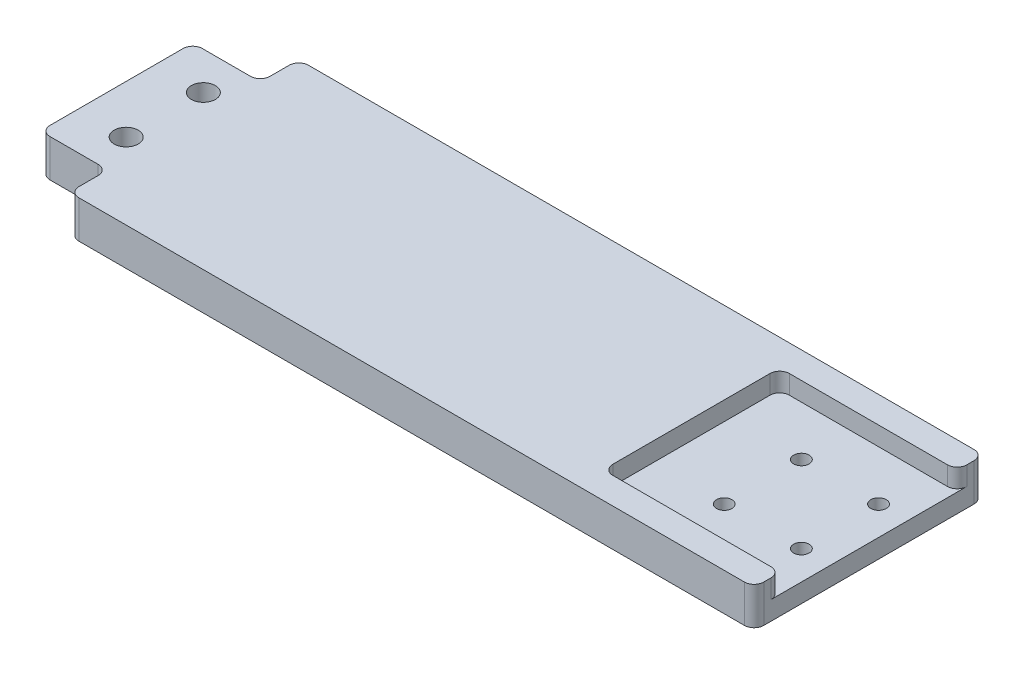
ISO-10303-21;
HEADER;
FILE_DESCRIPTION(('STEP AP214'),'2;1');
FILE_NAME('part.step','',(''),(''),'','','');
FILE_SCHEMA(('AUTOMOTIVE_DESIGN { 1 0 10303 214 1 1 1 1 }'));
ENDSEC;
DATA;
#1=APPLICATION_CONTEXT('core data for automotive mechanical design processes');
#2=APPLICATION_PROTOCOL_DEFINITION('international standard','automotive_design',2000,#1);
#3=PRODUCT_CONTEXT('',#1,'mechanical');
#4=PRODUCT('Part','Part','',(#3));
#5=PRODUCT_RELATED_PRODUCT_CATEGORY('part','',(#4));
#6=PRODUCT_DEFINITION_FORMATION('','',#4);
#7=PRODUCT_DEFINITION_CONTEXT('part definition',#1,'design');
#8=PRODUCT_DEFINITION('design','',#6,#7);
#9=PRODUCT_DEFINITION_SHAPE('','',#8);
#10=(LENGTH_UNIT() NAMED_UNIT(*) SI_UNIT(.MILLI.,.METRE.));
#11=(NAMED_UNIT(*) PLANE_ANGLE_UNIT() SI_UNIT($,.RADIAN.));
#12=(NAMED_UNIT(*) SI_UNIT($,.STERADIAN.) SOLID_ANGLE_UNIT());
#13=UNCERTAINTY_MEASURE_WITH_UNIT(LENGTH_MEASURE(1.E-05),#10,'distance_accuracy_value','');
#14=(GEOMETRIC_REPRESENTATION_CONTEXT(3) GLOBAL_UNCERTAINTY_ASSIGNED_CONTEXT((#13)) GLOBAL_UNIT_ASSIGNED_CONTEXT((#10,
#11,#12)) REPRESENTATION_CONTEXT('',''));
#15=CARTESIAN_POINT('',(0.,0.,0.));
#16=DIRECTION('',(0.,0.,1.));
#17=DIRECTION('',(1.,0.,0.));
#18=AXIS2_PLACEMENT_3D('',#15,#16,#17);
#19=CARTESIAN_POINT('',(-17.,3.9,-11.9));
#20=DIRECTION('',(-1.,0.,0.));
#21=DIRECTION('',(0.,0.,1.));
#22=AXIS2_PLACEMENT_3D('',#19,#20,#21);
#23=PLANE('',#22);
#24=DIRECTION('',(0.,0.,-1.));
#25=VECTOR('',#24,1.);
#26=CARTESIAN_POINT('',(-17.,3.9,-11.9));
#27=LINE('',#26,#25);
#28=CARTESIAN_POINT('',(-17.,3.9,10.9));
#29=VERTEX_POINT('',#28);
#30=CARTESIAN_POINT('',(-17.,3.9,10.15));
#31=VERTEX_POINT('',#30);
#32=EDGE_CURVE('E301',#29,#31,#27,.T.);
#33=ORIENTED_EDGE('',*,*,#32,.F.);
#34=DIRECTION('',(0.,-1.,0.));
#35=VECTOR('',#34,1.);
#36=CARTESIAN_POINT('',(-17.,3.9,10.9));
#37=LINE('',#36,#35);
#38=CARTESIAN_POINT('',(-17.,0.,10.9));
#39=VERTEX_POINT('',#38);
#40=EDGE_CURVE('E371',#29,#39,#37,.T.);
#41=ORIENTED_EDGE('',*,*,#40,.T.);
#42=DIRECTION('',(0.,0.,-1.));
#43=VECTOR('',#42,1.);
#44=CARTESIAN_POINT('',(-17.,0.,-11.9));
#45=LINE('',#44,#43);
#46=CARTESIAN_POINT('',(-17.,0.,-10.9));
#47=VERTEX_POINT('',#46);
#48=EDGE_CURVE('E307',#39,#47,#45,.T.);
#49=ORIENTED_EDGE('',*,*,#48,.T.);
#50=DIRECTION('',(0.,-1.,0.));
#51=VECTOR('',#50,1.);
#52=CARTESIAN_POINT('',(-17.,3.9,-10.9));
#53=LINE('',#52,#51);
#54=CARTESIAN_POINT('',(-17.,3.9,-10.9));
#55=VERTEX_POINT('',#54);
#56=EDGE_CURVE('E363',#47,#55,#53,.F.);
#57=ORIENTED_EDGE('',*,*,#56,.T.);
#58=CARTESIAN_POINT('',(-17.,3.9,-10.15));
#59=VERTEX_POINT('',#58);
#60=EDGE_CURVE('E297',#59,#55,#27,.T.);
#61=ORIENTED_EDGE('',*,*,#60,.F.);
#62=DIRECTION('',(0.,1.,0.));
#63=VECTOR('',#62,1.);
#64=CARTESIAN_POINT('',(-17.,1.95,-10.15));
#65=LINE('',#64,#63);
#66=CARTESIAN_POINT('',(-17.0000000000245,1.95,-10.15));
#67=VERTEX_POINT('',#66);
#68=EDGE_CURVE('E365',#59,#67,#65,.F.);
#69=ORIENTED_EDGE('',*,*,#68,.T.);
#70=DIRECTION('',(0.,0.,1.));
#71=VECTOR('',#70,1.);
#72=CARTESIAN_POINT('',(-17.0000000000245,1.95,0.));
#73=LINE('',#72,#71);
#74=CARTESIAN_POINT('',(-17.0000000000245,1.95,10.15));
#75=VERTEX_POINT('',#74);
#76=EDGE_CURVE('E262',#67,#75,#73,.T.);
#77=ORIENTED_EDGE('',*,*,#76,.T.);
#78=DIRECTION('',(0.,1.,0.));
#79=VECTOR('',#78,1.);
#80=CARTESIAN_POINT('',(-17.,3.9,10.15));
#81=LINE('',#80,#79);
#82=EDGE_CURVE('E368',#75,#31,#81,.T.);
#83=ORIENTED_EDGE('',*,*,#82,.T.);
#84=EDGE_LOOP('',(#33,#41,#49,#57,#61,#69,#77,#83));
#85=FACE_BOUND('',#84,.T.);
#86=ADVANCED_FACE('F43',(#85),#23,.F.);
#87=CARTESIAN_POINT('',(0.,3.9,0.));
#88=DIRECTION('',(0.,1.,0.));
#89=DIRECTION('',(0.,0.,1.));
#90=AXIS2_PLACEMENT_3D('',#87,#88,#89);
#91=PLANE('',#90);
#92=DIRECTION('',(1.,0.,0.));
#93=VECTOR('',#92,1.);
#94=CARTESIAN_POINT('',(-99.000000000049,3.9,11.9));
#95=LINE('',#94,#93);
#96=CARTESIAN_POINT('',(-87.0000000000603,3.9,11.9));
#97=VERTEX_POINT('',#96);
#98=CARTESIAN_POINT('',(-18.,3.9,11.9));
#99=VERTEX_POINT('',#98);
#100=EDGE_CURVE('E295',#97,#99,#95,.T.);
#101=ORIENTED_EDGE('',*,*,#100,.T.);
#102=CARTESIAN_POINT('',(-18.,3.9,10.9));
#103=DIRECTION('',(0.,1.,0.));
#104=DIRECTION('',(0.,0.,1.));
#105=AXIS2_PLACEMENT_3D('',#102,#103,#104);
#106=CIRCLE('',#105,1.);
#107=EDGE_CURVE('E386',#99,#29,#106,.T.);
#108=ORIENTED_EDGE('',*,*,#107,.T.);
#109=ORIENTED_EDGE('',*,*,#32,.T.);
#110=CARTESIAN_POINT('',(-18.,3.9,10.15));
#111=DIRECTION('',(0.,1.,0.));
#112=DIRECTION('',(0.,0.,1.));
#113=AXIS2_PLACEMENT_3D('',#110,#111,#112);
#114=CIRCLE('',#113,1.);
#115=CARTESIAN_POINT('',(-18.,3.9,9.15000000000001));
#116=VERTEX_POINT('',#115);
#117=EDGE_CURVE('E384',#31,#116,#114,.T.);
#118=ORIENTED_EDGE('',*,*,#117,.T.);
#119=DIRECTION('',(-1.,0.,0.));
#120=VECTOR('',#119,1.);
#121=CARTESIAN_POINT('',(0.,3.9,9.15000000000001));
#122=LINE('',#121,#120);
#123=CARTESIAN_POINT('',(-34.4000000000245,3.9,9.15000000000001));
#124=VERTEX_POINT('',#123);
#125=EDGE_CURVE('E274',#116,#124,#122,.T.);
#126=ORIENTED_EDGE('',*,*,#125,.T.);
#127=CARTESIAN_POINT('',(-34.4000000000245,3.9,8.15));
#128=DIRECTION('',(0.,1.,0.));
#129=DIRECTION('',(0.,0.,1.));
#130=AXIS2_PLACEMENT_3D('',#127,#128,#129);
#131=CIRCLE('',#130,1.);
#132=CARTESIAN_POINT('',(-35.4000000000245,3.9,8.15));
#133=VERTEX_POINT('',#132);
#134=EDGE_CURVE('E412',#124,#133,#131,.F.);
#135=ORIENTED_EDGE('',*,*,#134,.T.);
#136=DIRECTION('',(0.,0.,-1.));
#137=VECTOR('',#136,1.);
#138=CARTESIAN_POINT('',(-35.4000000000245,3.9,0.));
#139=LINE('',#138,#137);
#140=CARTESIAN_POINT('',(-35.4000000000245,3.9,-8.15));
#141=VERTEX_POINT('',#140);
#142=EDGE_CURVE('E263',#133,#141,#139,.T.);
#143=ORIENTED_EDGE('',*,*,#142,.T.);
#144=CARTESIAN_POINT('',(-34.4000000000245,3.9,-8.15));
#145=DIRECTION('',(0.,1.,0.));
#146=DIRECTION('',(0.,0.,1.));
#147=AXIS2_PLACEMENT_3D('',#144,#145,#146);
#148=CIRCLE('',#147,1.);
#149=CARTESIAN_POINT('',(-34.4000000000245,3.9,-9.15));
#150=VERTEX_POINT('',#149);
#151=EDGE_CURVE('E51',#141,#150,#148,.F.);
#152=ORIENTED_EDGE('',*,*,#151,.T.);
#153=DIRECTION('',(1.,0.,0.));
#154=VECTOR('',#153,1.);
#155=CARTESIAN_POINT('',(0.,3.9,-9.15));
#156=LINE('',#155,#154);
#157=CARTESIAN_POINT('',(-18.,3.9,-9.15));
#158=VERTEX_POINT('',#157);
#159=EDGE_CURVE('E259',#150,#158,#156,.T.);
#160=ORIENTED_EDGE('',*,*,#159,.T.);
#161=CARTESIAN_POINT('',(-18.,3.9,-10.15));
#162=DIRECTION('',(0.,1.,0.));
#163=DIRECTION('',(0.,0.,1.));
#164=AXIS2_PLACEMENT_3D('',#161,#162,#163);
#165=CIRCLE('',#164,1.);
#166=EDGE_CURVE('E382',#158,#59,#165,.T.);
#167=ORIENTED_EDGE('',*,*,#166,.T.);
#168=ORIENTED_EDGE('',*,*,#60,.T.);
#169=CARTESIAN_POINT('',(-18.,3.9,-10.9));
#170=DIRECTION('',(0.,1.,0.));
#171=DIRECTION('',(0.,0.,1.));
#172=AXIS2_PLACEMENT_3D('',#169,#170,#171);
#173=CIRCLE('',#172,1.);
#174=CARTESIAN_POINT('',(-18.,3.9,-11.9));
#175=VERTEX_POINT('',#174);
#176=EDGE_CURVE('E380',#55,#175,#173,.T.);
#177=ORIENTED_EDGE('',*,*,#176,.T.);
#178=DIRECTION('',(-1.,0.,0.));
#179=VECTOR('',#178,1.);
#180=CARTESIAN_POINT('',(-99.000000000049,3.9,-11.9));
#181=LINE('',#180,#179);
#182=CARTESIAN_POINT('',(-87.0000000000603,3.9,-11.9));
#183=VERTEX_POINT('',#182);
#184=EDGE_CURVE('E302',#175,#183,#181,.T.);
#185=ORIENTED_EDGE('',*,*,#184,.T.);
#186=CARTESIAN_POINT('',(-87.0000000000603,3.9,-10.9));
#187=DIRECTION('',(0.,1.,0.));
#188=DIRECTION('',(0.,0.,1.));
#189=AXIS2_PLACEMENT_3D('',#186,#187,#188);
#190=CIRCLE('',#189,1.);
#191=CARTESIAN_POINT('',(-88.0000000000603,3.9,-10.9));
#192=VERTEX_POINT('',#191);
#193=EDGE_CURVE('E213',#183,#192,#190,.T.);
#194=ORIENTED_EDGE('',*,*,#193,.T.);
#195=DIRECTION('',(0.,0.,-1.));
#196=VECTOR('',#195,1.);
#197=CARTESIAN_POINT('',(-88.0000000000603,3.9,-7.9));
#198=LINE('',#197,#196);
#199=CARTESIAN_POINT('',(-88.0000000000603,3.9,-8.9));
#200=VERTEX_POINT('',#199);
#201=EDGE_CURVE('E244',#200,#192,#198,.T.);
#202=ORIENTED_EDGE('',*,*,#201,.F.);
#203=CARTESIAN_POINT('',(-89.0000000000603,3.9,-8.9));
#204=DIRECTION('',(0.,1.,0.));
#205=DIRECTION('',(0.,0.,1.));
#206=AXIS2_PLACEMENT_3D('',#203,#204,#205);
#207=CIRCLE('',#206,1.);
#208=CARTESIAN_POINT('',(-89.0000000000603,3.9,-7.9));
#209=VERTEX_POINT('',#208);
#210=EDGE_CURVE('E356',#200,#209,#207,.F.);
#211=ORIENTED_EDGE('',*,*,#210,.T.);
#212=DIRECTION('',(1.,0.,0.));
#213=VECTOR('',#212,1.);
#214=CARTESIAN_POINT('',(-95.0000000000603,3.9,-7.9));
#215=LINE('',#214,#213);
#216=CARTESIAN_POINT('',(-94.0000000000603,3.9,-7.9));
#217=VERTEX_POINT('',#216);
#218=EDGE_CURVE('E241',#217,#209,#215,.T.);
#219=ORIENTED_EDGE('',*,*,#218,.F.);
#220=CARTESIAN_POINT('',(-94.0000000000603,3.9,-6.9));
#221=DIRECTION('',(0.,1.,0.));
#222=DIRECTION('',(0.,0.,1.));
#223=AXIS2_PLACEMENT_3D('',#220,#221,#222);
#224=CIRCLE('',#223,1.);
#225=CARTESIAN_POINT('',(-95.0000000000603,3.9,-6.9));
#226=VERTEX_POINT('',#225);
#227=EDGE_CURVE('E320',#217,#226,#224,.T.);
#228=ORIENTED_EDGE('',*,*,#227,.T.);
#229=DIRECTION('',(0.,0.,-1.));
#230=VECTOR('',#229,1.);
#231=CARTESIAN_POINT('',(-95.0000000000603,3.9,7.9));
#232=LINE('',#231,#230);
#233=CARTESIAN_POINT('',(-95.0000000000603,3.9,6.9));
#234=VERTEX_POINT('',#233);
#235=EDGE_CURVE('E233',#234,#226,#232,.T.);
#236=ORIENTED_EDGE('',*,*,#235,.F.);
#237=CARTESIAN_POINT('',(-94.0000000000603,3.9,6.9));
#238=DIRECTION('',(0.,1.,0.));
#239=DIRECTION('',(0.,0.,1.));
#240=AXIS2_PLACEMENT_3D('',#237,#238,#239);
#241=CIRCLE('',#240,1.);
#242=CARTESIAN_POINT('',(-94.0000000000603,3.9,7.9));
#243=VERTEX_POINT('',#242);
#244=EDGE_CURVE('E223',#234,#243,#241,.T.);
#245=ORIENTED_EDGE('',*,*,#244,.T.);
#246=DIRECTION('',(-1.,0.,0.));
#247=VECTOR('',#246,1.);
#248=CARTESIAN_POINT('',(-88.0000000000603,3.9,7.9));
#249=LINE('',#248,#247);
#250=CARTESIAN_POINT('',(-89.0000000000603,3.9,7.9));
#251=VERTEX_POINT('',#250);
#252=EDGE_CURVE('E230',#251,#243,#249,.T.);
#253=ORIENTED_EDGE('',*,*,#252,.F.);
#254=CARTESIAN_POINT('',(-89.0000000000603,3.9,8.9));
#255=DIRECTION('',(0.,1.,0.));
#256=DIRECTION('',(0.,0.,1.));
#257=AXIS2_PLACEMENT_3D('',#254,#255,#256);
#258=CIRCLE('',#257,1.);
#259=CARTESIAN_POINT('',(-88.0000000000603,3.9,8.9));
#260=VERTEX_POINT('',#259);
#261=EDGE_CURVE('E229',#251,#260,#258,.F.);
#262=ORIENTED_EDGE('',*,*,#261,.T.);
#263=DIRECTION('',(0.,0.,-1.));
#264=VECTOR('',#263,1.);
#265=CARTESIAN_POINT('',(-88.0000000000603,3.9,11.9));
#266=LINE('',#265,#264);
#267=CARTESIAN_POINT('',(-88.0000000000603,3.9,10.9));
#268=VERTEX_POINT('',#267);
#269=EDGE_CURVE('E219',#268,#260,#266,.T.);
#270=ORIENTED_EDGE('',*,*,#269,.F.);
#271=CARTESIAN_POINT('',(-87.0000000000603,3.9,10.9));
#272=DIRECTION('',(0.,1.,0.));
#273=DIRECTION('',(0.,0.,1.));
#274=AXIS2_PLACEMENT_3D('',#271,#272,#273);
#275=CIRCLE('',#274,1.);
#276=EDGE_CURVE('E203',#268,#97,#275,.T.);
#277=ORIENTED_EDGE('',*,*,#276,.T.);
#278=EDGE_LOOP('',(#101,#108,#109,#118,#126,#135,#143,#152,#160,#167,#168,#177,#185,#194,#202,
#211,#219,#228,#236,#245,#253,#262,#270,#277));
#279=FACE_BOUND('',#278,.T.);
#280=CARTESIAN_POINT('',(-90.0000000000603,3.9,4.00000000003676));
#281=DIRECTION('',(0.,1.,0.));
#282=DIRECTION('',(0.,0.,1.));
#283=AXIS2_PLACEMENT_3D('',#280,#281,#282);
#284=CIRCLE('',#283,1.24999999999999);
#285=CARTESIAN_POINT('',(-90.0000000000603,3.9,5.25000000003674));
#286=VERTEX_POINT('',#285);
#287=EDGE_CURVE('E250',#286,#286,#284,.T.);
#288=ORIENTED_EDGE('',*,*,#287,.F.);
#289=EDGE_LOOP('',(#288));
#290=FACE_BOUND('',#289,.T.);
#291=CARTESIAN_POINT('',(-90.0000000000603,3.9,-3.99999999996324));
#292=DIRECTION('',(0.,1.,0.));
#293=DIRECTION('',(0.,0.,1.));
#294=AXIS2_PLACEMENT_3D('',#291,#292,#293);
#295=CIRCLE('',#294,1.24999999999999);
#296=CARTESIAN_POINT('',(-90.0000000000603,3.9,-2.74999999996326));
#297=VERTEX_POINT('',#296);
#298=EDGE_CURVE('E253',#297,#297,#295,.T.);
#299=ORIENTED_EDGE('',*,*,#298,.F.);
#300=EDGE_LOOP('',(#299));
#301=FACE_BOUND('',#300,.T.);
#302=ADVANCED_FACE('F226',(#279,#290,#301),#91,.T.);
#303=CARTESIAN_POINT('',(-28.,3.9,4.));
#304=DIRECTION('',(0.,1.,0.));
#305=DIRECTION('',(0.,0.,1.));
#306=AXIS2_PLACEMENT_3D('',#303,#304,#305);
#307=CYLINDRICAL_SURFACE('',#306,0.799999999999999);
#308=CARTESIAN_POINT('',(-28.,1.95,4.));
#309=DIRECTION('',(0.,-1.,0.));
#310=DIRECTION('',(0.,0.,-1.));
#311=AXIS2_PLACEMENT_3D('',#308,#309,#310);
#312=CIRCLE('',#311,0.799999999999999);
#313=CARTESIAN_POINT('',(-28.,1.95,3.2));
#314=VERTEX_POINT('',#313);
#315=EDGE_CURVE('E285',#314,#314,#312,.F.);
#316=ORIENTED_EDGE('',*,*,#315,.T.);
#317=EDGE_LOOP('',(#316));
#318=FACE_BOUND('',#317,.T.);
#319=CARTESIAN_POINT('',(-28.,0.,4.));
#320=DIRECTION('',(0.,1.,0.));
#321=DIRECTION('',(0.,0.,1.));
#322=AXIS2_PLACEMENT_3D('',#319,#320,#321);
#323=CIRCLE('',#322,0.799999999999999);
#324=CARTESIAN_POINT('',(-28.,0.,4.8));
#325=VERTEX_POINT('',#324);
#326=EDGE_CURVE('E313',#325,#325,#323,.T.);
#327=ORIENTED_EDGE('',*,*,#326,.F.);
#328=EDGE_LOOP('',(#327));
#329=FACE_BOUND('',#328,.T.);
#330=ADVANCED_FACE('F529',(#318,#329),#307,.F.);
#331=CARTESIAN_POINT('',(-28.,3.9,-4.));
#332=DIRECTION('',(0.,1.,0.));
#333=DIRECTION('',(0.,0.,1.));
#334=AXIS2_PLACEMENT_3D('',#331,#332,#333);
#335=CYLINDRICAL_SURFACE('',#334,0.799999999999999);
#336=CARTESIAN_POINT('',(-28.,1.95,-4.));
#337=DIRECTION('',(0.,-1.,0.));
#338=DIRECTION('',(0.,0.,-1.));
#339=AXIS2_PLACEMENT_3D('',#336,#337,#338);
#340=CIRCLE('',#339,0.799999999999999);
#341=CARTESIAN_POINT('',(-28.,1.95,-4.8));
#342=VERTEX_POINT('',#341);
#343=EDGE_CURVE('E282',#342,#342,#340,.F.);
#344=ORIENTED_EDGE('',*,*,#343,.T.);
#345=EDGE_LOOP('',(#344));
#346=FACE_BOUND('',#345,.T.);
#347=CARTESIAN_POINT('',(-28.,0.,-4.));
#348=DIRECTION('',(0.,1.,0.));
#349=DIRECTION('',(0.,0.,1.));
#350=AXIS2_PLACEMENT_3D('',#347,#348,#349);
#351=CIRCLE('',#350,0.799999999999999);
#352=CARTESIAN_POINT('',(-28.,0.,-3.2));
#353=VERTEX_POINT('',#352);
#354=EDGE_CURVE('E304',#353,#353,#351,.T.);
#355=ORIENTED_EDGE('',*,*,#354,.F.);
#356=EDGE_LOOP('',(#355));
#357=FACE_BOUND('',#356,.T.);
#358=ADVANCED_FACE('F536',(#346,#357),#335,.F.);
#359=CARTESIAN_POINT('',(-99.000000000049,3.9,11.9));
#360=DIRECTION('',(0.,0.,-1.));
#361=DIRECTION('',(-1.,0.,0.));
#362=AXIS2_PLACEMENT_3D('',#359,#360,#361);
#363=PLANE('',#362);
#364=DIRECTION('',(1.,0.,0.));
#365=VECTOR('',#364,1.);
#366=CARTESIAN_POINT('',(-99.000000000049,0.,11.9));
#367=LINE('',#366,#365);
#368=CARTESIAN_POINT('',(-87.0000000000603,0.,11.9));
#369=VERTEX_POINT('',#368);
#370=CARTESIAN_POINT('',(-18.,0.,11.9));
#371=VERTEX_POINT('',#370);
#372=EDGE_CURVE('E294',#369,#371,#367,.T.);
#373=ORIENTED_EDGE('',*,*,#372,.T.);
#374=DIRECTION('',(0.,-1.,0.));
#375=VECTOR('',#374,1.);
#376=CARTESIAN_POINT('',(-18.,3.9,11.9));
#377=LINE('',#376,#375);
#378=EDGE_CURVE('E378',#371,#99,#377,.F.);
#379=ORIENTED_EDGE('',*,*,#378,.T.);
#380=ORIENTED_EDGE('',*,*,#100,.F.);
#381=DIRECTION('',(0.,1.,0.));
#382=VECTOR('',#381,1.);
#383=CARTESIAN_POINT('',(-87.0000000000603,3.9,11.9));
#384=LINE('',#383,#382);
#385=EDGE_CURVE('E208',#97,#369,#384,.F.);
#386=ORIENTED_EDGE('',*,*,#385,.T.);
#387=EDGE_LOOP('',(#373,#379,#380,#386));
#388=FACE_BOUND('',#387,.T.);
#389=ADVANCED_FACE('F510',(#388),#363,.F.);
#390=CARTESIAN_POINT('',(-99.000000000049,3.9,-11.9));
#391=DIRECTION('',(0.,0.,1.));
#392=DIRECTION('',(1.,0.,0.));
#393=AXIS2_PLACEMENT_3D('',#390,#391,#392);
#394=PLANE('',#393);
#395=ORIENTED_EDGE('',*,*,#184,.F.);
#396=DIRECTION('',(0.,-1.,0.));
#397=VECTOR('',#396,1.);
#398=CARTESIAN_POINT('',(-18.,3.9,-11.9));
#399=LINE('',#398,#397);
#400=CARTESIAN_POINT('',(-18.,0.,-11.9));
#401=VERTEX_POINT('',#400);
#402=EDGE_CURVE('E406',#175,#401,#399,.T.);
#403=ORIENTED_EDGE('',*,*,#402,.T.);
#404=DIRECTION('',(-1.,0.,0.));
#405=VECTOR('',#404,1.);
#406=CARTESIAN_POINT('',(-99.000000000049,0.,-11.9));
#407=LINE('',#406,#405);
#408=CARTESIAN_POINT('',(-87.0000000000603,0.,-11.9));
#409=VERTEX_POINT('',#408);
#410=EDGE_CURVE('E298',#401,#409,#407,.T.);
#411=ORIENTED_EDGE('',*,*,#410,.T.);
#412=DIRECTION('',(0.,1.,0.));
#413=VECTOR('',#412,1.);
#414=CARTESIAN_POINT('',(-87.0000000000603,3.9,-11.9));
#415=LINE('',#414,#413);
#416=EDGE_CURVE('E343',#409,#183,#415,.T.);
#417=ORIENTED_EDGE('',*,*,#416,.T.);
#418=EDGE_LOOP('',(#395,#403,#411,#417));
#419=FACE_BOUND('',#418,.T.);
#420=ADVANCED_FACE('F452',(#419),#394,.F.);
#421=CARTESIAN_POINT('',(0.,0.,0.));
#422=DIRECTION('',(0.,1.,0.));
#423=DIRECTION('',(0.,0.,1.));
#424=AXIS2_PLACEMENT_3D('',#421,#422,#423);
#425=PLANE('',#424);
#426=CARTESIAN_POINT('',(-90.0000000000603,0.,4.00000000003676));
#427=DIRECTION('',(0.,1.,0.));
#428=DIRECTION('',(0.,0.,1.));
#429=AXIS2_PLACEMENT_3D('',#426,#427,#428);
#430=CIRCLE('',#429,1.25);
#431=CARTESIAN_POINT('',(-90.0000000000603,0.,5.25000000003676));
#432=VERTEX_POINT('',#431);
#433=EDGE_CURVE('E247',#432,#432,#430,.T.);
#434=ORIENTED_EDGE('',*,*,#433,.T.);
#435=EDGE_LOOP('',(#434));
#436=FACE_BOUND('',#435,.T.);
#437=CARTESIAN_POINT('',(-90.0000000000603,0.,-3.99999999996324));
#438=DIRECTION('',(0.,1.,0.));
#439=DIRECTION('',(0.,0.,1.));
#440=AXIS2_PLACEMENT_3D('',#437,#438,#439);
#441=CIRCLE('',#440,1.25);
#442=CARTESIAN_POINT('',(-90.0000000000603,0.,-2.74999999996324));
#443=VERTEX_POINT('',#442);
#444=EDGE_CURVE('E256',#443,#443,#441,.T.);
#445=ORIENTED_EDGE('',*,*,#444,.T.);
#446=EDGE_LOOP('',(#445));
#447=FACE_BOUND('',#446,.T.);
#448=CARTESIAN_POINT('',(-20.,0.,4.));
#449=DIRECTION('',(0.,1.,0.));
#450=DIRECTION('',(0.,0.,1.));
#451=AXIS2_PLACEMENT_3D('',#448,#449,#450);
#452=CIRCLE('',#451,0.799999999999999);
#453=CARTESIAN_POINT('',(-20.,0.,4.8));
#454=VERTEX_POINT('',#453);
#455=EDGE_CURVE('E288',#454,#454,#452,.T.);
#456=ORIENTED_EDGE('',*,*,#455,.T.);
#457=EDGE_LOOP('',(#456));
#458=FACE_BOUND('',#457,.T.);
#459=CARTESIAN_POINT('',(-20.,0.,-4.));
#460=DIRECTION('',(0.,1.,0.));
#461=DIRECTION('',(0.,0.,1.));
#462=AXIS2_PLACEMENT_3D('',#459,#460,#461);
#463=CIRCLE('',#462,0.799999999999999);
#464=CARTESIAN_POINT('',(-20.,0.,-3.2));
#465=VERTEX_POINT('',#464);
#466=EDGE_CURVE('E291',#465,#465,#463,.T.);
#467=ORIENTED_EDGE('',*,*,#466,.T.);
#468=EDGE_LOOP('',(#467));
#469=FACE_BOUND('',#468,.T.);
#470=ORIENTED_EDGE('',*,*,#48,.F.);
#471=CARTESIAN_POINT('',(-18.,0.,10.9));
#472=DIRECTION('',(0.,1.,0.));
#473=DIRECTION('',(0.,0.,1.));
#474=AXIS2_PLACEMENT_3D('',#471,#472,#473);
#475=CIRCLE('',#474,1.);
#476=EDGE_CURVE('E376',#39,#371,#475,.F.);
#477=ORIENTED_EDGE('',*,*,#476,.T.);
#478=ORIENTED_EDGE('',*,*,#372,.F.);
#479=CARTESIAN_POINT('',(-87.0000000000603,0.,10.9));
#480=DIRECTION('',(0.,1.,0.));
#481=DIRECTION('',(0.,0.,1.));
#482=AXIS2_PLACEMENT_3D('',#479,#480,#481);
#483=CIRCLE('',#482,1.);
#484=CARTESIAN_POINT('',(-88.0000000000603,0.,10.9));
#485=VERTEX_POINT('',#484);
#486=EDGE_CURVE('E331',#369,#485,#483,.F.);
#487=ORIENTED_EDGE('',*,*,#486,.T.);
#488=DIRECTION('',(0.,0.,-1.));
#489=VECTOR('',#488,1.);
#490=CARTESIAN_POINT('',(-88.0000000000603,0.,11.9));
#491=LINE('',#490,#489);
#492=CARTESIAN_POINT('',(-88.0000000000603,0.,8.9));
#493=VERTEX_POINT('',#492);
#494=EDGE_CURVE('E222',#485,#493,#491,.T.);
#495=ORIENTED_EDGE('',*,*,#494,.T.);
#496=CARTESIAN_POINT('',(-89.0000000000603,0.,8.9));
#497=DIRECTION('',(0.,1.,0.));
#498=DIRECTION('',(0.,0.,1.));
#499=AXIS2_PLACEMENT_3D('',#496,#497,#498);
#500=CIRCLE('',#499,1.);
#501=CARTESIAN_POINT('',(-89.0000000000603,0.,7.9));
#502=VERTEX_POINT('',#501);
#503=EDGE_CURVE('E361',#493,#502,#500,.T.);
#504=ORIENTED_EDGE('',*,*,#503,.T.);
#505=DIRECTION('',(-1.,0.,0.));
#506=VECTOR('',#505,1.);
#507=CARTESIAN_POINT('',(-88.0000000000603,0.,7.9));
#508=LINE('',#507,#506);
#509=CARTESIAN_POINT('',(-94.0000000000603,0.,7.9));
#510=VERTEX_POINT('',#509);
#511=EDGE_CURVE('E500',#502,#510,#508,.T.);
#512=ORIENTED_EDGE('',*,*,#511,.T.);
#513=CARTESIAN_POINT('',(-94.0000000000603,0.,6.9));
#514=DIRECTION('',(0.,1.,0.));
#515=DIRECTION('',(0.,0.,1.));
#516=AXIS2_PLACEMENT_3D('',#513,#514,#515);
#517=CIRCLE('',#516,1.);
#518=CARTESIAN_POINT('',(-95.0000000000603,0.,6.9));
#519=VERTEX_POINT('',#518);
#520=EDGE_CURVE('E324',#510,#519,#517,.F.);
#521=ORIENTED_EDGE('',*,*,#520,.T.);
#522=DIRECTION('',(0.,0.,-1.));
#523=VECTOR('',#522,1.);
#524=CARTESIAN_POINT('',(-95.0000000000603,0.,7.9));
#525=LINE('',#524,#523);
#526=CARTESIAN_POINT('',(-95.0000000000603,0.,-6.9));
#527=VERTEX_POINT('',#526);
#528=EDGE_CURVE('E490',#519,#527,#525,.T.);
#529=ORIENTED_EDGE('',*,*,#528,.T.);
#530=CARTESIAN_POINT('',(-94.0000000000603,0.,-6.9));
#531=DIRECTION('',(0.,1.,0.));
#532=DIRECTION('',(0.,0.,1.));
#533=AXIS2_PLACEMENT_3D('',#530,#531,#532);
#534=CIRCLE('',#533,1.);
#535=CARTESIAN_POINT('',(-94.0000000000603,0.,-7.9));
#536=VERTEX_POINT('',#535);
#537=EDGE_CURVE('E326',#527,#536,#534,.F.);
#538=ORIENTED_EDGE('',*,*,#537,.T.);
#539=DIRECTION('',(1.,0.,0.));
#540=VECTOR('',#539,1.);
#541=CARTESIAN_POINT('',(-95.0000000000603,0.,-7.9));
#542=LINE('',#541,#540);
#543=CARTESIAN_POINT('',(-89.0000000000603,0.,-7.9));
#544=VERTEX_POINT('',#543);
#545=EDGE_CURVE('E479',#536,#544,#542,.T.);
#546=ORIENTED_EDGE('',*,*,#545,.T.);
#547=CARTESIAN_POINT('',(-89.0000000000603,0.,-8.9));
#548=DIRECTION('',(0.,1.,0.));
#549=DIRECTION('',(0.,0.,1.));
#550=AXIS2_PLACEMENT_3D('',#547,#548,#549);
#551=CIRCLE('',#550,1.);
#552=CARTESIAN_POINT('',(-88.0000000000603,0.,-8.9));
#553=VERTEX_POINT('',#552);
#554=EDGE_CURVE('E358',#544,#553,#551,.T.);
#555=ORIENTED_EDGE('',*,*,#554,.T.);
#556=DIRECTION('',(0.,0.,-1.));
#557=VECTOR('',#556,1.);
#558=CARTESIAN_POINT('',(-88.0000000000603,0.,-7.9));
#559=LINE('',#558,#557);
#560=CARTESIAN_POINT('',(-88.0000000000603,0.,-10.9));
#561=VERTEX_POINT('',#560);
#562=EDGE_CURVE('E236',#553,#561,#559,.T.);
#563=ORIENTED_EDGE('',*,*,#562,.T.);
#564=CARTESIAN_POINT('',(-87.0000000000603,0.,-10.9));
#565=DIRECTION('',(0.,1.,0.));
#566=DIRECTION('',(0.,0.,1.));
#567=AXIS2_PLACEMENT_3D('',#564,#565,#566);
#568=CIRCLE('',#567,1.);
#569=EDGE_CURVE('E328',#561,#409,#568,.F.);
#570=ORIENTED_EDGE('',*,*,#569,.T.);
#571=ORIENTED_EDGE('',*,*,#410,.F.);
#572=CARTESIAN_POINT('',(-18.,0.,-10.9));
#573=DIRECTION('',(0.,1.,0.));
#574=DIRECTION('',(0.,0.,1.));
#575=AXIS2_PLACEMENT_3D('',#572,#573,#574);
#576=CIRCLE('',#575,1.);
#577=EDGE_CURVE('E374',#401,#47,#576,.F.);
#578=ORIENTED_EDGE('',*,*,#577,.T.);
#579=EDGE_LOOP('',(#470,#477,#478,#487,#495,#504,#512,#521,#529,#538,#546,#555,#563,#570,#571,#578));
#580=FACE_BOUND('',#579,.T.);
#581=ORIENTED_EDGE('',*,*,#354,.T.);
#582=EDGE_LOOP('',(#581));
#583=FACE_BOUND('',#582,.T.);
#584=ORIENTED_EDGE('',*,*,#326,.T.);
#585=EDGE_LOOP('',(#584));
#586=FACE_BOUND('',#585,.T.);
#587=ADVANCED_FACE('F455',(#436,#447,#458,#469,#580,#583,#586),#425,.F.);
#588=CARTESIAN_POINT('',(-20.,3.9,-4.));
#589=DIRECTION('',(0.,1.,0.));
#590=DIRECTION('',(0.,0.,1.));
#591=AXIS2_PLACEMENT_3D('',#588,#589,#590);
#592=CYLINDRICAL_SURFACE('',#591,0.799999999999999);
#593=CARTESIAN_POINT('',(-20.,1.95,-4.));
#594=DIRECTION('',(0.,-1.,0.));
#595=DIRECTION('',(0.,0.,-1.));
#596=AXIS2_PLACEMENT_3D('',#593,#594,#595);
#597=CIRCLE('',#596,0.799999999999999);
#598=CARTESIAN_POINT('',(-20.,1.95,-4.8));
#599=VERTEX_POINT('',#598);
#600=EDGE_CURVE('E279',#599,#599,#597,.F.);
#601=ORIENTED_EDGE('',*,*,#600,.T.);
#602=EDGE_LOOP('',(#601));
#603=FACE_BOUND('',#602,.T.);
#604=ORIENTED_EDGE('',*,*,#466,.F.);
#605=EDGE_LOOP('',(#604));
#606=FACE_BOUND('',#605,.T.);
#607=ADVANCED_FACE('F607',(#603,#606),#592,.F.);
#608=CARTESIAN_POINT('',(-20.,3.9,4.));
#609=DIRECTION('',(0.,1.,0.));
#610=DIRECTION('',(0.,0.,1.));
#611=AXIS2_PLACEMENT_3D('',#608,#609,#610);
#612=CYLINDRICAL_SURFACE('',#611,0.799999999999999);
#613=CARTESIAN_POINT('',(-20.,1.95,4.));
#614=DIRECTION('',(0.,-1.,0.));
#615=DIRECTION('',(0.,0.,-1.));
#616=AXIS2_PLACEMENT_3D('',#613,#614,#615);
#617=CIRCLE('',#616,0.799999999999999);
#618=CARTESIAN_POINT('',(-20.,1.95,3.2));
#619=VERTEX_POINT('',#618);
#620=EDGE_CURVE('E271',#619,#619,#617,.F.);
#621=ORIENTED_EDGE('',*,*,#620,.T.);
#622=EDGE_LOOP('',(#621));
#623=FACE_BOUND('',#622,.T.);
#624=ORIENTED_EDGE('',*,*,#455,.F.);
#625=EDGE_LOOP('',(#624));
#626=FACE_BOUND('',#625,.T.);
#627=ADVANCED_FACE('F619',(#623,#626),#612,.F.);
#628=CARTESIAN_POINT('',(0.,1.95,0.));
#629=DIRECTION('',(0.,-1.,0.));
#630=DIRECTION('',(0.,0.,-1.));
#631=AXIS2_PLACEMENT_3D('',#628,#629,#630);
#632=PLANE('',#631);
#633=ORIENTED_EDGE('',*,*,#343,.F.);
#634=EDGE_LOOP('',(#633));
#635=FACE_BOUND('',#634,.T.);
#636=ORIENTED_EDGE('',*,*,#620,.F.);
#637=EDGE_LOOP('',(#636));
#638=FACE_BOUND('',#637,.T.);
#639=DIRECTION('',(0.,0.,-1.));
#640=VECTOR('',#639,1.);
#641=CARTESIAN_POINT('',(-35.4000000000245,1.95,0.));
#642=LINE('',#641,#640);
#643=CARTESIAN_POINT('',(-35.4000000000245,1.95,8.15));
#644=VERTEX_POINT('',#643);
#645=CARTESIAN_POINT('',(-35.4000000000245,1.95,-8.15));
#646=VERTEX_POINT('',#645);
#647=EDGE_CURVE('E268',#644,#646,#642,.T.);
#648=ORIENTED_EDGE('',*,*,#647,.F.);
#649=CARTESIAN_POINT('',(-34.4000000000245,1.95,8.15));
#650=DIRECTION('',(0.,-1.,0.));
#651=DIRECTION('',(0.,0.,-1.));
#652=AXIS2_PLACEMENT_3D('',#649,#650,#651);
#653=CIRCLE('',#652,1.);
#654=CARTESIAN_POINT('',(-34.4000000000245,1.95,9.15000000000001));
#655=VERTEX_POINT('',#654);
#656=EDGE_CURVE('E400',#644,#655,#653,.F.);
#657=ORIENTED_EDGE('',*,*,#656,.T.);
#658=DIRECTION('',(-1.,0.,0.));
#659=VECTOR('',#658,1.);
#660=CARTESIAN_POINT('',(0.,1.95,9.15000000000001));
#661=LINE('',#660,#659);
#662=CARTESIAN_POINT('',(-18.,1.95,9.15000000000001));
#663=VERTEX_POINT('',#662);
#664=EDGE_CURVE('E265',#663,#655,#661,.T.);
#665=ORIENTED_EDGE('',*,*,#664,.F.);
#666=CARTESIAN_POINT('',(-18.,1.95,10.15));
#667=DIRECTION('',(0.,-1.,0.));
#668=DIRECTION('',(0.,0.,-1.));
#669=AXIS2_PLACEMENT_3D('',#666,#667,#668);
#670=CIRCLE('',#669,1.);
#671=EDGE_CURVE('E409',#663,#75,#670,.T.);
#672=ORIENTED_EDGE('',*,*,#671,.T.);
#673=ORIENTED_EDGE('',*,*,#76,.F.);
#674=CARTESIAN_POINT('',(-18.,1.95,-10.15));
#675=DIRECTION('',(0.,-1.,0.));
#676=DIRECTION('',(0.,0.,-1.));
#677=AXIS2_PLACEMENT_3D('',#674,#675,#676);
#678=CIRCLE('',#677,1.);
#679=CARTESIAN_POINT('',(-18.,1.95,-9.15));
#680=VERTEX_POINT('',#679);
#681=EDGE_CURVE('E11',#67,#680,#678,.T.);
#682=ORIENTED_EDGE('',*,*,#681,.T.);
#683=DIRECTION('',(1.,0.,0.));
#684=VECTOR('',#683,1.);
#685=CARTESIAN_POINT('',(0.,1.95,-9.15));
#686=LINE('',#685,#684);
#687=CARTESIAN_POINT('',(-34.4000000000245,1.95,-9.15));
#688=VERTEX_POINT('',#687);
#689=EDGE_CURVE('E260',#688,#680,#686,.T.);
#690=ORIENTED_EDGE('',*,*,#689,.F.);
#691=CARTESIAN_POINT('',(-34.4000000000245,1.95,-8.15));
#692=DIRECTION('',(0.,-1.,0.));
#693=DIRECTION('',(0.,0.,-1.));
#694=AXIS2_PLACEMENT_3D('',#691,#692,#693);
#695=CIRCLE('',#694,1.);
#696=EDGE_CURVE('E398',#688,#646,#695,.F.);
#697=ORIENTED_EDGE('',*,*,#696,.T.);
#698=EDGE_LOOP('',(#648,#657,#665,#672,#673,#682,#690,#697));
#699=FACE_BOUND('',#698,.T.);
#700=ORIENTED_EDGE('',*,*,#600,.F.);
#701=EDGE_LOOP('',(#700));
#702=FACE_BOUND('',#701,.T.);
#703=ORIENTED_EDGE('',*,*,#315,.F.);
#704=EDGE_LOOP('',(#703));
#705=FACE_BOUND('',#704,.T.);
#706=ADVANCED_FACE('F421',(#635,#638,#699,#702,#705),#632,.F.);
#707=CARTESIAN_POINT('',(0.,1.95,-9.15));
#708=DIRECTION('',(0.,0.,1.));
#709=DIRECTION('',(1.,0.,0.));
#710=AXIS2_PLACEMENT_3D('',#707,#708,#709);
#711=PLANE('',#710);
#712=ORIENTED_EDGE('',*,*,#159,.F.);
#713=DIRECTION('',(0.,1.,0.));
#714=VECTOR('',#713,1.);
#715=CARTESIAN_POINT('',(-34.4000000000245,1.95,-9.15));
#716=LINE('',#715,#714);
#717=EDGE_CURVE('E63',#150,#688,#716,.F.);
#718=ORIENTED_EDGE('',*,*,#717,.T.);
#719=ORIENTED_EDGE('',*,*,#689,.T.);
#720=DIRECTION('',(0.,1.,0.));
#721=VECTOR('',#720,1.);
#722=CARTESIAN_POINT('',(-18.,3.9,-9.15));
#723=LINE('',#722,#721);
#724=EDGE_CURVE('E402',#680,#158,#723,.T.);
#725=ORIENTED_EDGE('',*,*,#724,.T.);
#726=EDGE_LOOP('',(#712,#718,#719,#725));
#727=FACE_BOUND('',#726,.T.);
#728=ADVANCED_FACE('F416',(#727),#711,.T.);
#729=CARTESIAN_POINT('',(0.,1.95,9.15000000000001));
#730=DIRECTION('',(0.,0.,-1.));
#731=DIRECTION('',(-1.,0.,0.));
#732=AXIS2_PLACEMENT_3D('',#729,#730,#731);
#733=PLANE('',#732);
#734=ORIENTED_EDGE('',*,*,#125,.F.);
#735=DIRECTION('',(0.,1.,0.));
#736=VECTOR('',#735,1.);
#737=CARTESIAN_POINT('',(-18.,1.95,9.15000000000001));
#738=LINE('',#737,#736);
#739=EDGE_CURVE('E391',#116,#663,#738,.F.);
#740=ORIENTED_EDGE('',*,*,#739,.T.);
#741=ORIENTED_EDGE('',*,*,#664,.T.);
#742=DIRECTION('',(0.,1.,0.));
#743=VECTOR('',#742,1.);
#744=CARTESIAN_POINT('',(-34.4000000000245,3.9,9.15000000000001));
#745=LINE('',#744,#743);
#746=EDGE_CURVE('E388',#655,#124,#745,.T.);
#747=ORIENTED_EDGE('',*,*,#746,.T.);
#748=EDGE_LOOP('',(#734,#740,#741,#747));
#749=FACE_BOUND('',#748,.T.);
#750=ADVANCED_FACE('F434',(#749),#733,.T.);
#751=CARTESIAN_POINT('',(-35.4000000000245,1.95,0.));
#752=DIRECTION('',(1.,0.,0.));
#753=DIRECTION('',(0.,0.,-1.));
#754=AXIS2_PLACEMENT_3D('',#751,#752,#753);
#755=PLANE('',#754);
#756=ORIENTED_EDGE('',*,*,#142,.F.);
#757=DIRECTION('',(0.,1.,0.));
#758=VECTOR('',#757,1.);
#759=CARTESIAN_POINT('',(-35.4000000000245,1.95,8.15));
#760=LINE('',#759,#758);
#761=EDGE_CURVE('E396',#133,#644,#760,.F.);
#762=ORIENTED_EDGE('',*,*,#761,.T.);
#763=ORIENTED_EDGE('',*,*,#647,.T.);
#764=DIRECTION('',(0.,1.,0.));
#765=VECTOR('',#764,1.);
#766=CARTESIAN_POINT('',(-35.4000000000245,3.9,-8.15));
#767=LINE('',#766,#765);
#768=EDGE_CURVE('E393',#646,#141,#767,.T.);
#769=ORIENTED_EDGE('',*,*,#768,.T.);
#770=EDGE_LOOP('',(#756,#762,#763,#769));
#771=FACE_BOUND('',#770,.T.);
#772=ADVANCED_FACE('F425',(#771),#755,.T.);
#773=CARTESIAN_POINT('',(-90.0000000000603,3.9,-3.99999999996324));
#774=DIRECTION('',(0.,1.,0.));
#775=DIRECTION('',(0.,0.,1.));
#776=AXIS2_PLACEMENT_3D('',#773,#774,#775);
#777=CYLINDRICAL_SURFACE('',#776,1.24999999999999);
#778=ORIENTED_EDGE('',*,*,#444,.F.);
#779=EDGE_LOOP('',(#778));
#780=FACE_BOUND('',#779,.T.);
#781=ORIENTED_EDGE('',*,*,#298,.T.);
#782=EDGE_LOOP('',(#781));
#783=FACE_BOUND('',#782,.T.);
#784=ADVANCED_FACE('F650',(#780,#783),#777,.F.);
#785=CARTESIAN_POINT('',(-90.0000000000603,3.9,4.00000000003676));
#786=DIRECTION('',(0.,1.,0.));
#787=DIRECTION('',(0.,0.,1.));
#788=AXIS2_PLACEMENT_3D('',#785,#786,#787);
#789=CYLINDRICAL_SURFACE('',#788,1.24999999999999);
#790=ORIENTED_EDGE('',*,*,#433,.F.);
#791=EDGE_LOOP('',(#790));
#792=FACE_BOUND('',#791,.T.);
#793=ORIENTED_EDGE('',*,*,#287,.T.);
#794=EDGE_LOOP('',(#793));
#795=FACE_BOUND('',#794,.T.);
#796=ADVANCED_FACE('F774',(#792,#795),#789,.F.);
#797=CARTESIAN_POINT('',(-88.0000000000603,0.,-7.9));
#798=DIRECTION('',(1.,0.,0.));
#799=DIRECTION('',(0.,0.,-1.));
#800=AXIS2_PLACEMENT_3D('',#797,#798,#799);
#801=PLANE('',#800);
#802=ORIENTED_EDGE('',*,*,#562,.F.);
#803=DIRECTION('',(0.,1.,0.));
#804=VECTOR('',#803,1.);
#805=CARTESIAN_POINT('',(-88.0000000000603,3.9,-8.9));
#806=LINE('',#805,#804);
#807=EDGE_CURVE('E335',#553,#200,#806,.T.);
#808=ORIENTED_EDGE('',*,*,#807,.T.);
#809=ORIENTED_EDGE('',*,*,#201,.T.);
#810=DIRECTION('',(0.,1.,0.));
#811=VECTOR('',#810,1.);
#812=CARTESIAN_POINT('',(-88.0000000000603,0.,-10.9));
#813=LINE('',#812,#811);
#814=EDGE_CURVE('E333',#192,#561,#813,.F.);
#815=ORIENTED_EDGE('',*,*,#814,.T.);
#816=EDGE_LOOP('',(#802,#808,#809,#815));
#817=FACE_BOUND('',#816,.T.);
#818=ADVANCED_FACE('F467',(#817),#801,.F.);
#819=CARTESIAN_POINT('',(-95.0000000000603,0.,-7.9));
#820=DIRECTION('',(0.,0.,1.));
#821=DIRECTION('',(1.,0.,0.));
#822=AXIS2_PLACEMENT_3D('',#819,#820,#821);
#823=PLANE('',#822);
#824=ORIENTED_EDGE('',*,*,#218,.T.);
#825=DIRECTION('',(0.,1.,0.));
#826=VECTOR('',#825,1.);
#827=CARTESIAN_POINT('',(-89.0000000000603,0.,-7.9));
#828=LINE('',#827,#826);
#829=EDGE_CURVE('E341',#209,#544,#828,.F.);
#830=ORIENTED_EDGE('',*,*,#829,.T.);
#831=ORIENTED_EDGE('',*,*,#545,.F.);
#832=DIRECTION('',(0.,1.,0.));
#833=VECTOR('',#832,1.);
#834=CARTESIAN_POINT('',(-94.0000000000603,0.,-7.9));
#835=LINE('',#834,#833);
#836=EDGE_CURVE('E338',#536,#217,#835,.T.);
#837=ORIENTED_EDGE('',*,*,#836,.T.);
#838=EDGE_LOOP('',(#824,#830,#831,#837));
#839=FACE_BOUND('',#838,.T.);
#840=ADVANCED_FACE('F475',(#839),#823,.F.);
#841=CARTESIAN_POINT('',(-95.0000000000603,0.,7.9));
#842=DIRECTION('',(1.,0.,0.));
#843=DIRECTION('',(0.,0.,-1.));
#844=AXIS2_PLACEMENT_3D('',#841,#842,#843);
#845=PLANE('',#844);
#846=ORIENTED_EDGE('',*,*,#235,.T.);
#847=DIRECTION('',(0.,1.,0.));
#848=VECTOR('',#847,1.);
#849=CARTESIAN_POINT('',(-95.0000000000603,0.,-6.9));
#850=LINE('',#849,#848);
#851=EDGE_CURVE('E349',#226,#527,#850,.F.);
#852=ORIENTED_EDGE('',*,*,#851,.T.);
#853=ORIENTED_EDGE('',*,*,#528,.F.);
#854=DIRECTION('',(0.,1.,0.));
#855=VECTOR('',#854,1.);
#856=CARTESIAN_POINT('',(-95.0000000000603,0.,6.9));
#857=LINE('',#856,#855);
#858=EDGE_CURVE('E346',#519,#234,#857,.T.);
#859=ORIENTED_EDGE('',*,*,#858,.T.);
#860=EDGE_LOOP('',(#846,#852,#853,#859));
#861=FACE_BOUND('',#860,.T.);
#862=ADVANCED_FACE('F486',(#861),#845,.F.);
#863=CARTESIAN_POINT('',(-88.0000000000603,0.,7.9));
#864=DIRECTION('',(0.,0.,-1.));
#865=DIRECTION('',(-1.,0.,0.));
#866=AXIS2_PLACEMENT_3D('',#863,#864,#865);
#867=PLANE('',#866);
#868=ORIENTED_EDGE('',*,*,#252,.T.);
#869=DIRECTION('',(0.,1.,0.));
#870=VECTOR('',#869,1.);
#871=CARTESIAN_POINT('',(-94.0000000000603,0.,7.9));
#872=LINE('',#871,#870);
#873=EDGE_CURVE('E354',#243,#510,#872,.F.);
#874=ORIENTED_EDGE('',*,*,#873,.T.);
#875=ORIENTED_EDGE('',*,*,#511,.F.);
#876=DIRECTION('',(0.,1.,0.));
#877=VECTOR('',#876,1.);
#878=CARTESIAN_POINT('',(-89.0000000000603,3.9,7.9));
#879=LINE('',#878,#877);
#880=EDGE_CURVE('E351',#502,#251,#879,.T.);
#881=ORIENTED_EDGE('',*,*,#880,.T.);
#882=EDGE_LOOP('',(#868,#874,#875,#881));
#883=FACE_BOUND('',#882,.T.);
#884=ADVANCED_FACE('F496',(#883),#867,.F.);
#885=CARTESIAN_POINT('',(-88.0000000000603,0.,11.9));
#886=DIRECTION('',(1.,0.,0.));
#887=DIRECTION('',(0.,0.,-1.));
#888=AXIS2_PLACEMENT_3D('',#885,#886,#887);
#889=PLANE('',#888);
#890=ORIENTED_EDGE('',*,*,#494,.F.);
#891=DIRECTION('',(0.,1.,0.));
#892=VECTOR('',#891,1.);
#893=CARTESIAN_POINT('',(-88.0000000000603,0.,10.9));
#894=LINE('',#893,#892);
#895=EDGE_CURVE('E207',#485,#268,#894,.T.);
#896=ORIENTED_EDGE('',*,*,#895,.T.);
#897=ORIENTED_EDGE('',*,*,#269,.T.);
#898=DIRECTION('',(0.,1.,0.));
#899=VECTOR('',#898,1.);
#900=CARTESIAN_POINT('',(-88.0000000000603,0.,8.9));
#901=LINE('',#900,#899);
#902=EDGE_CURVE('E224',#260,#493,#901,.F.);
#903=ORIENTED_EDGE('',*,*,#902,.T.);
#904=EDGE_LOOP('',(#890,#896,#897,#903));
#905=FACE_BOUND('',#904,.T.);
#906=ADVANCED_FACE('F218',(#905),#889,.F.);
#907=CARTESIAN_POINT('',(-87.0000000000603,0.,10.9));
#908=DIRECTION('',(0.,1.,0.));
#909=DIRECTION('',(0.,0.,1.));
#910=AXIS2_PLACEMENT_3D('',#907,#908,#909);
#911=CYLINDRICAL_SURFACE('',#910,1.);
#912=ORIENTED_EDGE('',*,*,#486,.F.);
#913=ORIENTED_EDGE('',*,*,#385,.F.);
#914=ORIENTED_EDGE('',*,*,#276,.F.);
#915=ORIENTED_EDGE('',*,*,#895,.F.);
#916=EDGE_LOOP('',(#912,#913,#914,#915));
#917=FACE_BOUND('',#916,.T.);
#918=ADVANCED_FACE('F206',(#917),#911,.T.);
#919=CARTESIAN_POINT('',(-89.0000000000603,0.,-8.9));
#920=DIRECTION('',(0.,-1.,0.));
#921=DIRECTION('',(0.,0.,-1.));
#922=AXIS2_PLACEMENT_3D('',#919,#920,#921);
#923=CYLINDRICAL_SURFACE('',#922,1.);
#924=ORIENTED_EDGE('',*,*,#554,.F.);
#925=ORIENTED_EDGE('',*,*,#829,.F.);
#926=ORIENTED_EDGE('',*,*,#210,.F.);
#927=ORIENTED_EDGE('',*,*,#807,.F.);
#928=EDGE_LOOP('',(#924,#925,#926,#927));
#929=FACE_BOUND('',#928,.T.);
#930=ADVANCED_FACE('F471',(#929),#923,.F.);
#931=CARTESIAN_POINT('',(-87.0000000000603,3.9,-10.9));
#932=DIRECTION('',(0.,1.,0.));
#933=DIRECTION('',(0.,0.,1.));
#934=AXIS2_PLACEMENT_3D('',#931,#932,#933);
#935=CYLINDRICAL_SURFACE('',#934,1.);
#936=ORIENTED_EDGE('',*,*,#569,.F.);
#937=ORIENTED_EDGE('',*,*,#814,.F.);
#938=ORIENTED_EDGE('',*,*,#193,.F.);
#939=ORIENTED_EDGE('',*,*,#416,.F.);
#940=EDGE_LOOP('',(#936,#937,#938,#939));
#941=FACE_BOUND('',#940,.T.);
#942=ADVANCED_FACE('F464',(#941),#935,.T.);
#943=CARTESIAN_POINT('',(-94.0000000000603,0.,-6.9));
#944=DIRECTION('',(0.,1.,0.));
#945=DIRECTION('',(0.,0.,1.));
#946=AXIS2_PLACEMENT_3D('',#943,#944,#945);
#947=CYLINDRICAL_SURFACE('',#946,1.);
#948=ORIENTED_EDGE('',*,*,#537,.F.);
#949=ORIENTED_EDGE('',*,*,#851,.F.);
#950=ORIENTED_EDGE('',*,*,#227,.F.);
#951=ORIENTED_EDGE('',*,*,#836,.F.);
#952=EDGE_LOOP('',(#948,#949,#950,#951));
#953=FACE_BOUND('',#952,.T.);
#954=ADVANCED_FACE('F482',(#953),#947,.T.);
#955=CARTESIAN_POINT('',(-94.0000000000603,0.,6.9));
#956=DIRECTION('',(0.,1.,0.));
#957=DIRECTION('',(0.,0.,1.));
#958=AXIS2_PLACEMENT_3D('',#955,#956,#957);
#959=CYLINDRICAL_SURFACE('',#958,1.);
#960=ORIENTED_EDGE('',*,*,#520,.F.);
#961=ORIENTED_EDGE('',*,*,#873,.F.);
#962=ORIENTED_EDGE('',*,*,#244,.F.);
#963=ORIENTED_EDGE('',*,*,#858,.F.);
#964=EDGE_LOOP('',(#960,#961,#962,#963));
#965=FACE_BOUND('',#964,.T.);
#966=ADVANCED_FACE('F493',(#965),#959,.T.);
#967=CARTESIAN_POINT('',(-89.0000000000603,0.,8.9));
#968=DIRECTION('',(0.,-1.,0.));
#969=DIRECTION('',(0.,0.,-1.));
#970=AXIS2_PLACEMENT_3D('',#967,#968,#969);
#971=CYLINDRICAL_SURFACE('',#970,1.);
#972=ORIENTED_EDGE('',*,*,#503,.F.);
#973=ORIENTED_EDGE('',*,*,#902,.F.);
#974=ORIENTED_EDGE('',*,*,#261,.F.);
#975=ORIENTED_EDGE('',*,*,#880,.F.);
#976=EDGE_LOOP('',(#972,#973,#974,#975));
#977=FACE_BOUND('',#976,.T.);
#978=ADVANCED_FACE('F503',(#977),#971,.F.);
#979=CARTESIAN_POINT('',(-18.,3.9,10.9));
#980=DIRECTION('',(0.,-1.,0.));
#981=DIRECTION('',(0.,0.,-1.));
#982=AXIS2_PLACEMENT_3D('',#979,#980,#981);
#983=CYLINDRICAL_SURFACE('',#982,1.);
#984=ORIENTED_EDGE('',*,*,#107,.F.);
#985=ORIENTED_EDGE('',*,*,#378,.F.);
#986=ORIENTED_EDGE('',*,*,#476,.F.);
#987=ORIENTED_EDGE('',*,*,#40,.F.);
#988=EDGE_LOOP('',(#984,#985,#986,#987));
#989=FACE_BOUND('',#988,.T.);
#990=ADVANCED_FACE('F513',(#989),#983,.T.);
#991=CARTESIAN_POINT('',(-18.,3.9,10.15));
#992=DIRECTION('',(0.,-1.,0.));
#993=DIRECTION('',(0.,0.,-1.));
#994=AXIS2_PLACEMENT_3D('',#991,#992,#993);
#995=CYLINDRICAL_SURFACE('',#994,1.);
#996=ORIENTED_EDGE('',*,*,#671,.F.);
#997=ORIENTED_EDGE('',*,*,#739,.F.);
#998=ORIENTED_EDGE('',*,*,#117,.F.);
#999=ORIENTED_EDGE('',*,*,#82,.F.);
#1000=EDGE_LOOP('',(#996,#997,#998,#999));
#1001=FACE_BOUND('',#1000,.T.);
#1002=ADVANCED_FACE('F437',(#1001),#995,.T.);
#1003=CARTESIAN_POINT('',(-34.4000000000245,1.95,8.15));
#1004=DIRECTION('',(0.,-1.,0.));
#1005=DIRECTION('',(0.,0.,-1.));
#1006=AXIS2_PLACEMENT_3D('',#1003,#1004,#1005);
#1007=CYLINDRICAL_SURFACE('',#1006,1.);
#1008=ORIENTED_EDGE('',*,*,#656,.F.);
#1009=ORIENTED_EDGE('',*,*,#761,.F.);
#1010=ORIENTED_EDGE('',*,*,#134,.F.);
#1011=ORIENTED_EDGE('',*,*,#746,.F.);
#1012=EDGE_LOOP('',(#1008,#1009,#1010,#1011));
#1013=FACE_BOUND('',#1012,.T.);
#1014=ADVANCED_FACE('F428',(#1013),#1007,.F.);
#1015=CARTESIAN_POINT('',(-34.4000000000245,1.95,-8.15));
#1016=DIRECTION('',(0.,-1.,0.));
#1017=DIRECTION('',(0.,0.,-1.));
#1018=AXIS2_PLACEMENT_3D('',#1015,#1016,#1017);
#1019=CYLINDRICAL_SURFACE('',#1018,1.);
#1020=ORIENTED_EDGE('',*,*,#696,.F.);
#1021=ORIENTED_EDGE('',*,*,#717,.F.);
#1022=ORIENTED_EDGE('',*,*,#151,.F.);
#1023=ORIENTED_EDGE('',*,*,#768,.F.);
#1024=EDGE_LOOP('',(#1020,#1021,#1022,#1023));
#1025=FACE_BOUND('',#1024,.T.);
#1026=ADVANCED_FACE('F419',(#1025),#1019,.F.);
#1027=CARTESIAN_POINT('',(-18.,1.95,-10.15));
#1028=DIRECTION('',(0.,-1.,0.));
#1029=DIRECTION('',(0.,0.,-1.));
#1030=AXIS2_PLACEMENT_3D('',#1027,#1028,#1029);
#1031=CYLINDRICAL_SURFACE('',#1030,1.);
#1032=ORIENTED_EDGE('',*,*,#681,.F.);
#1033=ORIENTED_EDGE('',*,*,#68,.F.);
#1034=ORIENTED_EDGE('',*,*,#166,.F.);
#1035=ORIENTED_EDGE('',*,*,#724,.F.);
#1036=EDGE_LOOP('',(#1032,#1033,#1034,#1035));
#1037=FACE_BOUND('',#1036,.T.);
#1038=ADVANCED_FACE('F444',(#1037),#1031,.T.);
#1039=CARTESIAN_POINT('',(-18.,3.9,-10.9));
#1040=DIRECTION('',(0.,-1.,0.));
#1041=DIRECTION('',(0.,0.,-1.));
#1042=AXIS2_PLACEMENT_3D('',#1039,#1040,#1041);
#1043=CYLINDRICAL_SURFACE('',#1042,1.);
#1044=ORIENTED_EDGE('',*,*,#176,.F.);
#1045=ORIENTED_EDGE('',*,*,#56,.F.);
#1046=ORIENTED_EDGE('',*,*,#577,.F.);
#1047=ORIENTED_EDGE('',*,*,#402,.F.);
#1048=EDGE_LOOP('',(#1044,#1045,#1046,#1047));
#1049=FACE_BOUND('',#1048,.T.);
#1050=ADVANCED_FACE('F45',(#1049),#1043,.T.);
#1051=CLOSED_SHELL('',(#86,#302,#330,#358,#389,#420,#587,#607,#627,#706,#728,#750,#772,#784,
#796,#818,#840,#862,#884,#906,#918,#930,#942,#954,#966,#978,#990,#1002,#1014,#1026,#1038,#1050));
#1052=MANIFOLD_SOLID_BREP('B2',#1051);
#1053=ADVANCED_BREP_SHAPE_REPRESENTATION('',(#18,#1052),#14);
#1054=SHAPE_DEFINITION_REPRESENTATION(#9,#1053);
ENDSEC;
END-ISO-10303-21;
